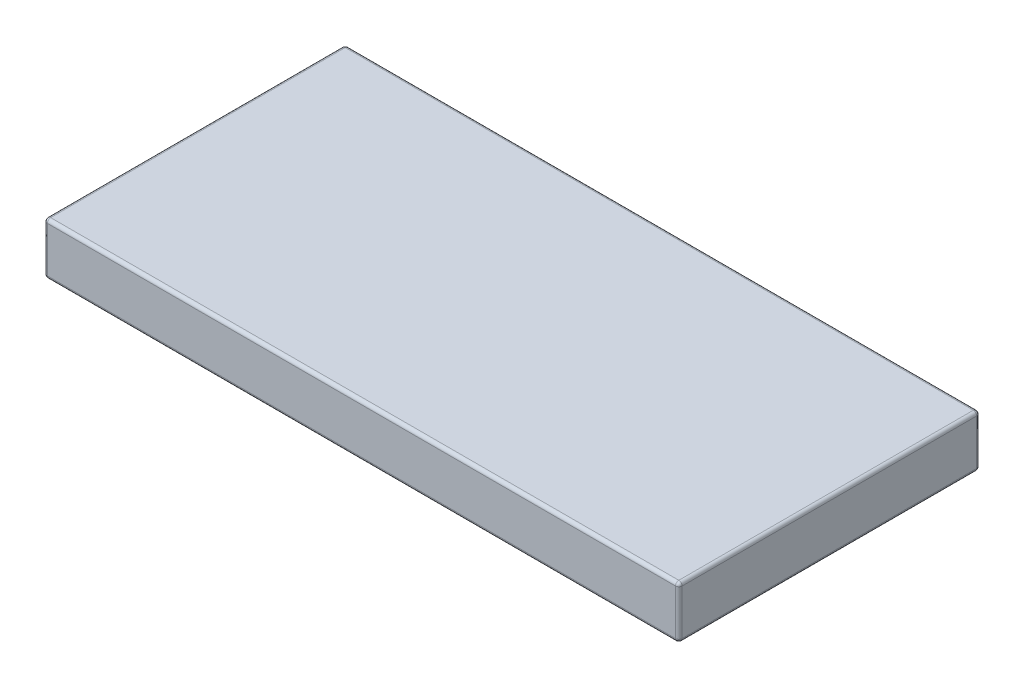
ISO-10303-21;
HEADER;
FILE_DESCRIPTION(('STEP AP214'),'2;1');
FILE_NAME('part.step','',(''),(''),'','','');
FILE_SCHEMA(('AUTOMOTIVE_DESIGN { 1 0 10303 214 1 1 1 1 }'));
ENDSEC;
DATA;
#1=APPLICATION_CONTEXT('core data for automotive mechanical design processes');
#2=APPLICATION_PROTOCOL_DEFINITION('international standard','automotive_design',2000,#1);
#3=PRODUCT_CONTEXT('',#1,'mechanical');
#4=PRODUCT('Part','Part','',(#3));
#5=PRODUCT_RELATED_PRODUCT_CATEGORY('part','',(#4));
#6=PRODUCT_DEFINITION_FORMATION('','',#4);
#7=PRODUCT_DEFINITION_CONTEXT('part definition',#1,'design');
#8=PRODUCT_DEFINITION('design','',#6,#7);
#9=PRODUCT_DEFINITION_SHAPE('','',#8);
#10=(LENGTH_UNIT() NAMED_UNIT(*) SI_UNIT(.MILLI.,.METRE.));
#11=(NAMED_UNIT(*) PLANE_ANGLE_UNIT() SI_UNIT($,.RADIAN.));
#12=(NAMED_UNIT(*) SI_UNIT($,.STERADIAN.) SOLID_ANGLE_UNIT());
#13=UNCERTAINTY_MEASURE_WITH_UNIT(LENGTH_MEASURE(1.E-05),#10,'distance_accuracy_value','');
#14=(GEOMETRIC_REPRESENTATION_CONTEXT(3) GLOBAL_UNCERTAINTY_ASSIGNED_CONTEXT((#13)) GLOBAL_UNIT_ASSIGNED_CONTEXT((#10,
#11,#12)) REPRESENTATION_CONTEXT('',''));
#15=CARTESIAN_POINT('',(0.,0.,0.));
#16=DIRECTION('',(0.,0.,1.));
#17=DIRECTION('',(1.,0.,0.));
#18=AXIS2_PLACEMENT_3D('',#15,#16,#17);
#19=CARTESIAN_POINT('',(9.57,1.57,4.54));
#20=DIRECTION('',(-1.,0.,0.));
#21=DIRECTION('',(0.,0.,1.));
#22=AXIS2_PLACEMENT_3D('',#19,#20,#21);
#23=PLANE('',#22);
#24=DIRECTION('',(0.,0.,-1.));
#25=VECTOR('',#24,1.);
#26=CARTESIAN_POINT('',(9.57,0.1,-4.54));
#27=LINE('',#26,#25);
#28=CARTESIAN_POINT('',(9.57,0.1,4.44));
#29=VERTEX_POINT('',#28);
#30=CARTESIAN_POINT('',(9.57,0.1,-4.44));
#31=VERTEX_POINT('',#30);
#32=EDGE_CURVE('E194',#29,#31,#27,.T.);
#33=ORIENTED_EDGE('',*,*,#32,.T.);
#34=DIRECTION('',(0.,-1.,0.));
#35=VECTOR('',#34,1.);
#36=CARTESIAN_POINT('',(9.57,1.57,-4.44));
#37=LINE('',#36,#35);
#38=CARTESIAN_POINT('',(9.57,1.47,-4.44));
#39=VERTEX_POINT('',#38);
#40=EDGE_CURVE('E197',#31,#39,#37,.F.);
#41=ORIENTED_EDGE('',*,*,#40,.T.);
#42=DIRECTION('',(0.,0.,-1.));
#43=VECTOR('',#42,1.);
#44=CARTESIAN_POINT('',(9.57,1.47,4.54));
#45=LINE('',#44,#43);
#46=CARTESIAN_POINT('',(9.57,1.47,4.44));
#47=VERTEX_POINT('',#46);
#48=EDGE_CURVE('E195',#39,#47,#45,.F.);
#49=ORIENTED_EDGE('',*,*,#48,.T.);
#50=DIRECTION('',(0.,-1.,0.));
#51=VECTOR('',#50,1.);
#52=CARTESIAN_POINT('',(9.57,1.57,4.44));
#53=LINE('',#52,#51);
#54=EDGE_CURVE('E188',#47,#29,#53,.T.);
#55=ORIENTED_EDGE('',*,*,#54,.T.);
#56=EDGE_LOOP('',(#33,#41,#49,#55));
#57=FACE_BOUND('',#56,.T.);
#58=ADVANCED_FACE('F36',(#57),#23,.F.);
#59=CARTESIAN_POINT('',(-9.57,1.57,-4.54));
#60=DIRECTION('',(0.,0.,1.));
#61=DIRECTION('',(1.,0.,0.));
#62=AXIS2_PLACEMENT_3D('',#59,#60,#61);
#63=PLANE('',#62);
#64=DIRECTION('',(-1.,0.,0.));
#65=VECTOR('',#64,1.);
#66=CARTESIAN_POINT('',(-9.57,0.1,-4.54));
#67=LINE('',#66,#65);
#68=CARTESIAN_POINT('',(9.47,0.1,-4.54));
#69=VERTEX_POINT('',#68);
#70=CARTESIAN_POINT('',(-9.47,0.1,-4.54));
#71=VERTEX_POINT('',#70);
#72=EDGE_CURVE('E181',#69,#71,#67,.T.);
#73=ORIENTED_EDGE('',*,*,#72,.T.);
#74=DIRECTION('',(0.,-1.,0.));
#75=VECTOR('',#74,1.);
#76=CARTESIAN_POINT('',(-9.47,1.57,-4.54));
#77=LINE('',#76,#75);
#78=CARTESIAN_POINT('',(-9.47,1.47,-4.54));
#79=VERTEX_POINT('',#78);
#80=EDGE_CURVE('E190',#71,#79,#77,.F.);
#81=ORIENTED_EDGE('',*,*,#80,.T.);
#82=DIRECTION('',(-1.,0.,0.));
#83=VECTOR('',#82,1.);
#84=CARTESIAN_POINT('',(-9.57,1.47,-4.54));
#85=LINE('',#84,#83);
#86=CARTESIAN_POINT('',(9.47,1.47,-4.54));
#87=VERTEX_POINT('',#86);
#88=EDGE_CURVE('E183',#79,#87,#85,.F.);
#89=ORIENTED_EDGE('',*,*,#88,.T.);
#90=DIRECTION('',(0.,-1.,0.));
#91=VECTOR('',#90,1.);
#92=CARTESIAN_POINT('',(9.47,1.57,-4.54));
#93=LINE('',#92,#91);
#94=EDGE_CURVE('E182',#87,#69,#93,.T.);
#95=ORIENTED_EDGE('',*,*,#94,.T.);
#96=EDGE_LOOP('',(#73,#81,#89,#95));
#97=FACE_BOUND('',#96,.T.);
#98=ADVANCED_FACE('F281',(#97),#63,.F.);
#99=CARTESIAN_POINT('',(-9.57,1.57,4.54));
#100=DIRECTION('',(1.,0.,0.));
#101=DIRECTION('',(0.,0.,-1.));
#102=AXIS2_PLACEMENT_3D('',#99,#100,#101);
#103=PLANE('',#102);
#104=DIRECTION('',(0.,0.,1.));
#105=VECTOR('',#104,1.);
#106=CARTESIAN_POINT('',(-9.57,0.1,4.54));
#107=LINE('',#106,#105);
#108=CARTESIAN_POINT('',(-9.57,0.1,-4.44));
#109=VERTEX_POINT('',#108);
#110=CARTESIAN_POINT('',(-9.57,0.1,4.44));
#111=VERTEX_POINT('',#110);
#112=EDGE_CURVE('E171',#109,#111,#107,.T.);
#113=ORIENTED_EDGE('',*,*,#112,.T.);
#114=DIRECTION('',(0.,-1.,0.));
#115=VECTOR('',#114,1.);
#116=CARTESIAN_POINT('',(-9.57,1.57,4.44));
#117=LINE('',#116,#115);
#118=CARTESIAN_POINT('',(-9.57,1.47,4.44));
#119=VERTEX_POINT('',#118);
#120=EDGE_CURVE('E178',#111,#119,#117,.F.);
#121=ORIENTED_EDGE('',*,*,#120,.T.);
#122=DIRECTION('',(0.,0.,1.));
#123=VECTOR('',#122,1.);
#124=CARTESIAN_POINT('',(-9.57,1.47,4.54));
#125=LINE('',#124,#123);
#126=CARTESIAN_POINT('',(-9.57,1.47,-4.44));
#127=VERTEX_POINT('',#126);
#128=EDGE_CURVE('E176',#119,#127,#125,.F.);
#129=ORIENTED_EDGE('',*,*,#128,.T.);
#130=DIRECTION('',(0.,-1.,0.));
#131=VECTOR('',#130,1.);
#132=CARTESIAN_POINT('',(-9.57,1.57,-4.44));
#133=LINE('',#132,#131);
#134=EDGE_CURVE('E174',#127,#109,#133,.T.);
#135=ORIENTED_EDGE('',*,*,#134,.T.);
#136=EDGE_LOOP('',(#113,#121,#129,#135));
#137=FACE_BOUND('',#136,.T.);
#138=ADVANCED_FACE('F274',(#137),#103,.F.);
#139=CARTESIAN_POINT('',(-9.57,1.57,4.54));
#140=DIRECTION('',(0.,0.,-1.));
#141=DIRECTION('',(-1.,0.,0.));
#142=AXIS2_PLACEMENT_3D('',#139,#140,#141);
#143=PLANE('',#142);
#144=DIRECTION('',(1.,0.,0.));
#145=VECTOR('',#144,1.);
#146=CARTESIAN_POINT('',(-9.57,1.47,4.54));
#147=LINE('',#146,#145);
#148=CARTESIAN_POINT('',(9.47,1.47,4.54));
#149=VERTEX_POINT('',#148);
#150=CARTESIAN_POINT('',(-9.47,1.47,4.54));
#151=VERTEX_POINT('',#150);
#152=EDGE_CURVE('E135',#149,#151,#147,.F.);
#153=ORIENTED_EDGE('',*,*,#152,.T.);
#154=DIRECTION('',(0.,-1.,0.));
#155=VECTOR('',#154,1.);
#156=CARTESIAN_POINT('',(-9.47,1.57,4.54));
#157=LINE('',#156,#155);
#158=CARTESIAN_POINT('',(-9.47,0.1,4.54));
#159=VERTEX_POINT('',#158);
#160=EDGE_CURVE('E168',#151,#159,#157,.T.);
#161=ORIENTED_EDGE('',*,*,#160,.T.);
#162=DIRECTION('',(1.,0.,0.));
#163=VECTOR('',#162,1.);
#164=CARTESIAN_POINT('',(9.57,0.1,4.54));
#165=LINE('',#164,#163);
#166=CARTESIAN_POINT('',(9.47,0.1,4.54));
#167=VERTEX_POINT('',#166);
#168=EDGE_CURVE('E162',#159,#167,#165,.T.);
#169=ORIENTED_EDGE('',*,*,#168,.T.);
#170=DIRECTION('',(0.,-1.,0.));
#171=VECTOR('',#170,1.);
#172=CARTESIAN_POINT('',(9.47,1.57,4.54));
#173=LINE('',#172,#171);
#174=EDGE_CURVE('E161',#167,#149,#173,.F.);
#175=ORIENTED_EDGE('',*,*,#174,.T.);
#176=EDGE_LOOP('',(#153,#161,#169,#175));
#177=FACE_BOUND('',#176,.T.);
#178=ADVANCED_FACE('F315',(#177),#143,.F.);
#179=CARTESIAN_POINT('',(0.,1.57,0.));
#180=DIRECTION('',(0.,-1.,0.));
#181=DIRECTION('',(0.,0.,-1.));
#182=AXIS2_PLACEMENT_3D('',#179,#180,#181);
#183=PLANE('',#182);
#184=DIRECTION('',(0.,0.,1.));
#185=VECTOR('',#184,1.);
#186=CARTESIAN_POINT('',(-9.47,1.57,0.));
#187=LINE('',#186,#185);
#188=CARTESIAN_POINT('',(-9.47,1.57,-4.44));
#189=VERTEX_POINT('',#188);
#190=CARTESIAN_POINT('',(-9.47,1.57,4.44));
#191=VERTEX_POINT('',#190);
#192=EDGE_CURVE('E157',#189,#191,#187,.T.);
#193=ORIENTED_EDGE('',*,*,#192,.T.);
#194=DIRECTION('',(1.,0.,0.));
#195=VECTOR('',#194,1.);
#196=CARTESIAN_POINT('',(0.,1.57,4.44));
#197=LINE('',#196,#195);
#198=CARTESIAN_POINT('',(9.47,1.57,4.44));
#199=VERTEX_POINT('',#198);
#200=EDGE_CURVE('E132',#191,#199,#197,.T.);
#201=ORIENTED_EDGE('',*,*,#200,.T.);
#202=DIRECTION('',(0.,0.,-1.));
#203=VECTOR('',#202,1.);
#204=CARTESIAN_POINT('',(9.47,1.57,0.));
#205=LINE('',#204,#203);
#206=CARTESIAN_POINT('',(9.47,1.57,-4.44));
#207=VERTEX_POINT('',#206);
#208=EDGE_CURVE('E149',#199,#207,#205,.T.);
#209=ORIENTED_EDGE('',*,*,#208,.T.);
#210=DIRECTION('',(-1.,0.,0.));
#211=VECTOR('',#210,1.);
#212=CARTESIAN_POINT('',(0.,1.57,-4.44));
#213=LINE('',#212,#211);
#214=EDGE_CURVE('E154',#207,#189,#213,.T.);
#215=ORIENTED_EDGE('',*,*,#214,.T.);
#216=EDGE_LOOP('',(#193,#201,#209,#215));
#217=FACE_BOUND('',#216,.T.);
#218=ADVANCED_FACE('F160',(#217),#183,.F.);
#219=CARTESIAN_POINT('',(0.,0.,0.));
#220=DIRECTION('',(0.,-1.,0.));
#221=DIRECTION('',(0.,0.,-1.));
#222=AXIS2_PLACEMENT_3D('',#219,#220,#221);
#223=PLANE('',#222);
#224=DIRECTION('',(0.,0.,1.));
#225=VECTOR('',#224,1.);
#226=CARTESIAN_POINT('',(-9.47,0.,-4.54));
#227=LINE('',#226,#225);
#228=CARTESIAN_POINT('',(-9.47,0.,4.44));
#229=VERTEX_POINT('',#228);
#230=CARTESIAN_POINT('',(-9.47,0.,-4.44));
#231=VERTEX_POINT('',#230);
#232=EDGE_CURVE('E50',#229,#231,#227,.F.);
#233=ORIENTED_EDGE('',*,*,#232,.T.);
#234=DIRECTION('',(-1.,0.,0.));
#235=VECTOR('',#234,1.);
#236=CARTESIAN_POINT('',(9.57,0.,-4.44));
#237=LINE('',#236,#235);
#238=CARTESIAN_POINT('',(9.47,0.,-4.44));
#239=VERTEX_POINT('',#238);
#240=EDGE_CURVE('E11',#231,#239,#237,.F.);
#241=ORIENTED_EDGE('',*,*,#240,.T.);
#242=DIRECTION('',(0.,0.,-1.));
#243=VECTOR('',#242,1.);
#244=CARTESIAN_POINT('',(9.47,0.,4.54));
#245=LINE('',#244,#243);
#246=CARTESIAN_POINT('',(9.47,0.,4.44));
#247=VERTEX_POINT('',#246);
#248=EDGE_CURVE('E200',#239,#247,#245,.F.);
#249=ORIENTED_EDGE('',*,*,#248,.T.);
#250=DIRECTION('',(1.,0.,0.));
#251=VECTOR('',#250,1.);
#252=CARTESIAN_POINT('',(-9.57,0.,4.44));
#253=LINE('',#252,#251);
#254=EDGE_CURVE('E59',#247,#229,#253,.F.);
#255=ORIENTED_EDGE('',*,*,#254,.T.);
#256=EDGE_LOOP('',(#233,#241,#249,#255));
#257=FACE_BOUND('',#256,.T.);
#258=ADVANCED_FACE('F297',(#257),#223,.T.);
#259=CARTESIAN_POINT('',(-9.57,0.1,-4.44));
#260=DIRECTION('',(1.,0.,0.));
#261=DIRECTION('',(0.,0.,-1.));
#262=AXIS2_PLACEMENT_3D('',#259,#260,#261);
#263=CYLINDRICAL_SURFACE('',#262,0.1);
#264=CARTESIAN_POINT('',(-9.47,0.1,-4.44));
#265=DIRECTION('',(-1.,0.,0.));
#266=DIRECTION('',(0.,0.,1.));
#267=AXIS2_PLACEMENT_3D('',#264,#265,#266);
#268=CIRCLE('',#267,0.1);
#269=EDGE_CURVE('E45',#71,#231,#268,.T.);
#270=ORIENTED_EDGE('',*,*,#269,.F.);
#271=ORIENTED_EDGE('',*,*,#72,.F.);
#272=CARTESIAN_POINT('',(9.47,0.1,-4.44));
#273=DIRECTION('',(1.,0.,0.));
#274=DIRECTION('',(0.,0.,-1.));
#275=AXIS2_PLACEMENT_3D('',#272,#273,#274);
#276=CIRCLE('',#275,0.1);
#277=EDGE_CURVE('E251',#239,#69,#276,.T.);
#278=ORIENTED_EDGE('',*,*,#277,.F.);
#279=ORIENTED_EDGE('',*,*,#240,.F.);
#280=EDGE_LOOP('',(#270,#271,#278,#279));
#281=FACE_BOUND('',#280,.T.);
#282=ADVANCED_FACE('F37',(#281),#263,.T.);
#283=CARTESIAN_POINT('',(-9.47,0.1,-4.44));
#284=DIRECTION('',(0.,-1.,0.));
#285=DIRECTION('',(0.,0.,-1.));
#286=AXIS2_PLACEMENT_3D('',#283,#284,#285);
#287=SPHERICAL_SURFACE('',#286,0.1);
#288=CARTESIAN_POINT('',(-9.47,0.1,-4.44));
#289=DIRECTION('',(0.,-1.,0.));
#290=DIRECTION('',(0.,0.,-1.));
#291=AXIS2_PLACEMENT_3D('',#288,#289,#290);
#292=CIRCLE('',#291,0.1);
#293=EDGE_CURVE('E247',#71,#109,#292,.F.);
#294=ORIENTED_EDGE('',*,*,#293,.F.);
#295=ORIENTED_EDGE('',*,*,#269,.T.);
#296=CARTESIAN_POINT('',(-9.47,0.1,-4.44));
#297=DIRECTION('',(0.,0.,-1.));
#298=DIRECTION('',(-1.,0.,0.));
#299=AXIS2_PLACEMENT_3D('',#296,#297,#298);
#300=CIRCLE('',#299,0.1);
#301=EDGE_CURVE('E253',#109,#231,#300,.F.);
#302=ORIENTED_EDGE('',*,*,#301,.F.);
#303=EDGE_LOOP('',(#294,#295,#302));
#304=FACE_BOUND('',#303,.T.);
#305=ADVANCED_FACE('F262',(#304),#287,.T.);
#306=CARTESIAN_POINT('',(9.47,0.1,-4.44));
#307=DIRECTION('',(0.,0.,-1.));
#308=DIRECTION('',(0.,1.,0.));
#309=AXIS2_PLACEMENT_3D('',#306,#307,#308);
#310=SPHERICAL_SURFACE('',#309,0.1);
#311=CARTESIAN_POINT('',(9.47,0.1,-4.44));
#312=DIRECTION('',(0.,0.,-1.));
#313=DIRECTION('',(-1.,0.,0.));
#314=AXIS2_PLACEMENT_3D('',#311,#312,#313);
#315=CIRCLE('',#314,0.1);
#316=EDGE_CURVE('E244',#239,#31,#315,.F.);
#317=ORIENTED_EDGE('',*,*,#316,.F.);
#318=ORIENTED_EDGE('',*,*,#277,.T.);
#319=CARTESIAN_POINT('',(9.47,0.1,-4.44));
#320=DIRECTION('',(0.,-1.,0.));
#321=DIRECTION('',(0.,0.,-1.));
#322=AXIS2_PLACEMENT_3D('',#319,#320,#321);
#323=CIRCLE('',#322,0.1);
#324=EDGE_CURVE('E243',#31,#69,#323,.F.);
#325=ORIENTED_EDGE('',*,*,#324,.F.);
#326=EDGE_LOOP('',(#317,#318,#325));
#327=FACE_BOUND('',#326,.T.);
#328=ADVANCED_FACE('F464',(#327),#310,.T.);
#329=CARTESIAN_POINT('',(-9.47,0.1,4.54));
#330=DIRECTION('',(0.,0.,-1.));
#331=DIRECTION('',(-1.,0.,0.));
#332=AXIS2_PLACEMENT_3D('',#329,#330,#331);
#333=CYLINDRICAL_SURFACE('',#332,0.1);
#334=ORIENTED_EDGE('',*,*,#301,.T.);
#335=ORIENTED_EDGE('',*,*,#232,.F.);
#336=CARTESIAN_POINT('',(-9.47,0.1,4.44));
#337=DIRECTION('',(0.,0.,1.));
#338=DIRECTION('',(1.,0.,0.));
#339=AXIS2_PLACEMENT_3D('',#336,#337,#338);
#340=CIRCLE('',#339,0.1);
#341=EDGE_CURVE('E237',#111,#229,#340,.T.);
#342=ORIENTED_EDGE('',*,*,#341,.F.);
#343=ORIENTED_EDGE('',*,*,#112,.F.);
#344=EDGE_LOOP('',(#334,#335,#342,#343));
#345=FACE_BOUND('',#344,.T.);
#346=ADVANCED_FACE('F269',(#345),#333,.T.);
#347=CARTESIAN_POINT('',(-9.47,1.57,-4.44));
#348=DIRECTION('',(0.,-1.,0.));
#349=DIRECTION('',(0.,0.,-1.));
#350=AXIS2_PLACEMENT_3D('',#347,#348,#349);
#351=CYLINDRICAL_SURFACE('',#350,0.1);
#352=ORIENTED_EDGE('',*,*,#293,.T.);
#353=ORIENTED_EDGE('',*,*,#134,.F.);
#354=CARTESIAN_POINT('',(-9.47,1.47,-4.44));
#355=DIRECTION('',(0.,1.,0.));
#356=DIRECTION('',(0.,0.,1.));
#357=AXIS2_PLACEMENT_3D('',#354,#355,#356);
#358=CIRCLE('',#357,0.1);
#359=EDGE_CURVE('E234',#79,#127,#358,.T.);
#360=ORIENTED_EDGE('',*,*,#359,.F.);
#361=ORIENTED_EDGE('',*,*,#80,.F.);
#362=EDGE_LOOP('',(#352,#353,#360,#361));
#363=FACE_BOUND('',#362,.T.);
#364=ADVANCED_FACE('F282',(#363),#351,.T.);
#365=CARTESIAN_POINT('',(0.,1.47,-4.44));
#366=DIRECTION('',(-1.,0.,0.));
#367=DIRECTION('',(0.,0.,1.));
#368=AXIS2_PLACEMENT_3D('',#365,#366,#367);
#369=CYLINDRICAL_SURFACE('',#368,0.1);
#370=CARTESIAN_POINT('',(9.47,1.47,-4.44));
#371=DIRECTION('',(1.,0.,0.));
#372=DIRECTION('',(0.,0.,-1.));
#373=AXIS2_PLACEMENT_3D('',#370,#371,#372);
#374=CIRCLE('',#373,0.1);
#375=EDGE_CURVE('E229',#87,#207,#374,.T.);
#376=ORIENTED_EDGE('',*,*,#375,.F.);
#377=ORIENTED_EDGE('',*,*,#88,.F.);
#378=CARTESIAN_POINT('',(-9.47,1.47,-4.44));
#379=DIRECTION('',(-1.,0.,0.));
#380=DIRECTION('',(0.,0.,1.));
#381=AXIS2_PLACEMENT_3D('',#378,#379,#380);
#382=CIRCLE('',#381,0.1);
#383=EDGE_CURVE('E228',#189,#79,#382,.T.);
#384=ORIENTED_EDGE('',*,*,#383,.F.);
#385=ORIENTED_EDGE('',*,*,#214,.F.);
#386=EDGE_LOOP('',(#376,#377,#384,#385));
#387=FACE_BOUND('',#386,.T.);
#388=ADVANCED_FACE('F289',(#387),#369,.T.);
#389=CARTESIAN_POINT('',(9.47,1.57,-4.44));
#390=DIRECTION('',(0.,-1.,0.));
#391=DIRECTION('',(0.,0.,-1.));
#392=AXIS2_PLACEMENT_3D('',#389,#390,#391);
#393=CYLINDRICAL_SURFACE('',#392,0.1);
#394=ORIENTED_EDGE('',*,*,#324,.T.);
#395=ORIENTED_EDGE('',*,*,#94,.F.);
#396=CARTESIAN_POINT('',(9.47,1.47,-4.44));
#397=DIRECTION('',(0.,1.,0.));
#398=DIRECTION('',(0.,0.,1.));
#399=AXIS2_PLACEMENT_3D('',#396,#397,#398);
#400=CIRCLE('',#399,0.1);
#401=EDGE_CURVE('E223',#39,#87,#400,.T.);
#402=ORIENTED_EDGE('',*,*,#401,.F.);
#403=ORIENTED_EDGE('',*,*,#40,.F.);
#404=EDGE_LOOP('',(#394,#395,#402,#403));
#405=FACE_BOUND('',#404,.T.);
#406=ADVANCED_FACE('F294',(#405),#393,.T.);
#407=CARTESIAN_POINT('',(9.47,0.1,4.54));
#408=DIRECTION('',(0.,0.,1.));
#409=DIRECTION('',(1.,0.,0.));
#410=AXIS2_PLACEMENT_3D('',#407,#408,#409);
#411=CYLINDRICAL_SURFACE('',#410,0.1);
#412=ORIENTED_EDGE('',*,*,#316,.T.);
#413=ORIENTED_EDGE('',*,*,#32,.F.);
#414=CARTESIAN_POINT('',(9.47,0.1,4.44));
#415=DIRECTION('',(0.,0.,1.));
#416=DIRECTION('',(1.,0.,0.));
#417=AXIS2_PLACEMENT_3D('',#414,#415,#416);
#418=CIRCLE('',#417,0.1);
#419=EDGE_CURVE('E225',#247,#29,#418,.T.);
#420=ORIENTED_EDGE('',*,*,#419,.F.);
#421=ORIENTED_EDGE('',*,*,#248,.F.);
#422=EDGE_LOOP('',(#412,#413,#420,#421));
#423=FACE_BOUND('',#422,.T.);
#424=ADVANCED_FACE('F301',(#423),#411,.T.);
#425=CARTESIAN_POINT('',(-9.57,0.1,4.44));
#426=DIRECTION('',(-1.,0.,0.));
#427=DIRECTION('',(0.,0.,1.));
#428=AXIS2_PLACEMENT_3D('',#425,#426,#427);
#429=CYLINDRICAL_SURFACE('',#428,0.1);
#430=CARTESIAN_POINT('',(-9.47,0.1,4.44));
#431=DIRECTION('',(-1.,0.,0.));
#432=DIRECTION('',(0.,0.,1.));
#433=AXIS2_PLACEMENT_3D('',#430,#431,#432);
#434=CIRCLE('',#433,0.1);
#435=EDGE_CURVE('E239',#229,#159,#434,.T.);
#436=ORIENTED_EDGE('',*,*,#435,.F.);
#437=ORIENTED_EDGE('',*,*,#254,.F.);
#438=CARTESIAN_POINT('',(9.47,0.1,4.44));
#439=DIRECTION('',(1.,0.,0.));
#440=DIRECTION('',(0.,0.,-1.));
#441=AXIS2_PLACEMENT_3D('',#438,#439,#440);
#442=CIRCLE('',#441,0.1);
#443=EDGE_CURVE('E218',#167,#247,#442,.T.);
#444=ORIENTED_EDGE('',*,*,#443,.F.);
#445=ORIENTED_EDGE('',*,*,#168,.F.);
#446=EDGE_LOOP('',(#436,#437,#444,#445));
#447=FACE_BOUND('',#446,.T.);
#448=ADVANCED_FACE('F303',(#447),#429,.T.);
#449=CARTESIAN_POINT('',(-9.47,0.1,4.44));
#450=DIRECTION('',(0.,-1.,0.));
#451=DIRECTION('',(0.,0.,-1.));
#452=AXIS2_PLACEMENT_3D('',#449,#450,#451);
#453=SPHERICAL_SURFACE('',#452,0.1);
#454=ORIENTED_EDGE('',*,*,#341,.T.);
#455=ORIENTED_EDGE('',*,*,#435,.T.);
#456=CARTESIAN_POINT('',(-9.47,0.1,4.44));
#457=DIRECTION('',(0.,-1.,0.));
#458=DIRECTION('',(0.,0.,-1.));
#459=AXIS2_PLACEMENT_3D('',#456,#457,#458);
#460=CIRCLE('',#459,0.1);
#461=EDGE_CURVE('E216',#111,#159,#460,.F.);
#462=ORIENTED_EDGE('',*,*,#461,.F.);
#463=EDGE_LOOP('',(#454,#455,#462));
#464=FACE_BOUND('',#463,.T.);
#465=ADVANCED_FACE('F312',(#464),#453,.T.);
#466=CARTESIAN_POINT('',(-9.47,1.47,-4.44));
#467=DIRECTION('',(0.,0.,-1.));
#468=DIRECTION('',(-1.,0.,0.));
#469=AXIS2_PLACEMENT_3D('',#466,#467,#468);
#470=SPHERICAL_SURFACE('',#469,0.1);
#471=ORIENTED_EDGE('',*,*,#383,.T.);
#472=ORIENTED_EDGE('',*,*,#359,.T.);
#473=CARTESIAN_POINT('',(-9.47,1.47,-4.44));
#474=DIRECTION('',(0.,0.,-1.));
#475=DIRECTION('',(0.,1.,0.));
#476=AXIS2_PLACEMENT_3D('',#473,#474,#475);
#477=CIRCLE('',#476,0.1);
#478=EDGE_CURVE('E212',#189,#127,#477,.F.);
#479=ORIENTED_EDGE('',*,*,#478,.F.);
#480=EDGE_LOOP('',(#471,#472,#479));
#481=FACE_BOUND('',#480,.T.);
#482=ADVANCED_FACE('F324',(#481),#470,.T.);
#483=CARTESIAN_POINT('',(9.47,1.47,-4.44));
#484=DIRECTION('',(0.,0.,-1.));
#485=DIRECTION('',(-1.,0.,0.));
#486=AXIS2_PLACEMENT_3D('',#483,#484,#485);
#487=SPHERICAL_SURFACE('',#486,0.1);
#488=ORIENTED_EDGE('',*,*,#401,.T.);
#489=ORIENTED_EDGE('',*,*,#375,.T.);
#490=CARTESIAN_POINT('',(9.47,1.47,-4.44));
#491=DIRECTION('',(0.,0.,-1.));
#492=DIRECTION('',(-1.,0.,0.));
#493=AXIS2_PLACEMENT_3D('',#490,#491,#492);
#494=CIRCLE('',#493,0.1);
#495=EDGE_CURVE('E155',#39,#207,#494,.F.);
#496=ORIENTED_EDGE('',*,*,#495,.F.);
#497=EDGE_LOOP('',(#488,#489,#496));
#498=FACE_BOUND('',#497,.T.);
#499=ADVANCED_FACE('F330',(#498),#487,.T.);
#500=CARTESIAN_POINT('',(9.47,0.1,4.44));
#501=DIRECTION('',(0.,-1.,0.));
#502=DIRECTION('',(0.,0.,-1.));
#503=AXIS2_PLACEMENT_3D('',#500,#501,#502);
#504=SPHERICAL_SURFACE('',#503,0.1);
#505=ORIENTED_EDGE('',*,*,#443,.T.);
#506=ORIENTED_EDGE('',*,*,#419,.T.);
#507=CARTESIAN_POINT('',(9.47,0.1,4.44));
#508=DIRECTION('',(0.,-1.,0.));
#509=DIRECTION('',(0.,0.,-1.));
#510=AXIS2_PLACEMENT_3D('',#507,#508,#509);
#511=CIRCLE('',#510,0.1);
#512=EDGE_CURVE('E209',#167,#29,#511,.F.);
#513=ORIENTED_EDGE('',*,*,#512,.F.);
#514=EDGE_LOOP('',(#505,#506,#513));
#515=FACE_BOUND('',#514,.T.);
#516=ADVANCED_FACE('F307',(#515),#504,.T.);
#517=CARTESIAN_POINT('',(-9.47,1.57,4.44));
#518=DIRECTION('',(0.,-1.,0.));
#519=DIRECTION('',(0.,0.,-1.));
#520=AXIS2_PLACEMENT_3D('',#517,#518,#519);
#521=CYLINDRICAL_SURFACE('',#520,0.1);
#522=ORIENTED_EDGE('',*,*,#461,.T.);
#523=ORIENTED_EDGE('',*,*,#160,.F.);
#524=CARTESIAN_POINT('',(-9.47,1.47,4.44));
#525=DIRECTION('',(0.,1.,0.));
#526=DIRECTION('',(0.,0.,1.));
#527=AXIS2_PLACEMENT_3D('',#524,#525,#526);
#528=CIRCLE('',#527,0.1);
#529=EDGE_CURVE('E210',#119,#151,#528,.T.);
#530=ORIENTED_EDGE('',*,*,#529,.F.);
#531=ORIENTED_EDGE('',*,*,#120,.F.);
#532=EDGE_LOOP('',(#522,#523,#530,#531));
#533=FACE_BOUND('',#532,.T.);
#534=ADVANCED_FACE('F320',(#533),#521,.T.);
#535=CARTESIAN_POINT('',(-9.47,1.47,0.));
#536=DIRECTION('',(0.,0.,1.));
#537=DIRECTION('',(1.,0.,0.));
#538=AXIS2_PLACEMENT_3D('',#535,#536,#537);
#539=CYLINDRICAL_SURFACE('',#538,0.1);
#540=ORIENTED_EDGE('',*,*,#478,.T.);
#541=ORIENTED_EDGE('',*,*,#128,.F.);
#542=CARTESIAN_POINT('',(-9.47,1.47,4.44));
#543=DIRECTION('',(0.,0.,1.));
#544=DIRECTION('',(1.,0.,0.));
#545=AXIS2_PLACEMENT_3D('',#542,#543,#544);
#546=CIRCLE('',#545,0.1);
#547=EDGE_CURVE('E148',#191,#119,#546,.T.);
#548=ORIENTED_EDGE('',*,*,#547,.F.);
#549=ORIENTED_EDGE('',*,*,#192,.F.);
#550=EDGE_LOOP('',(#540,#541,#548,#549));
#551=FACE_BOUND('',#550,.T.);
#552=ADVANCED_FACE('F323',(#551),#539,.T.);
#553=CARTESIAN_POINT('',(9.47,1.47,0.));
#554=DIRECTION('',(0.,0.,-1.));
#555=DIRECTION('',(-1.,0.,0.));
#556=AXIS2_PLACEMENT_3D('',#553,#554,#555);
#557=CYLINDRICAL_SURFACE('',#556,0.1);
#558=ORIENTED_EDGE('',*,*,#495,.T.);
#559=ORIENTED_EDGE('',*,*,#208,.F.);
#560=CARTESIAN_POINT('',(9.47,1.47,4.44));
#561=DIRECTION('',(0.,0.,1.));
#562=DIRECTION('',(1.,0.,0.));
#563=AXIS2_PLACEMENT_3D('',#560,#561,#562);
#564=CIRCLE('',#563,0.1);
#565=EDGE_CURVE('E137',#47,#199,#564,.T.);
#566=ORIENTED_EDGE('',*,*,#565,.F.);
#567=ORIENTED_EDGE('',*,*,#48,.F.);
#568=EDGE_LOOP('',(#558,#559,#566,#567));
#569=FACE_BOUND('',#568,.T.);
#570=ADVANCED_FACE('F147',(#569),#557,.T.);
#571=CARTESIAN_POINT('',(9.47,1.57,4.44));
#572=DIRECTION('',(0.,-1.,0.));
#573=DIRECTION('',(0.,0.,-1.));
#574=AXIS2_PLACEMENT_3D('',#571,#572,#573);
#575=CYLINDRICAL_SURFACE('',#574,0.1);
#576=ORIENTED_EDGE('',*,*,#512,.T.);
#577=ORIENTED_EDGE('',*,*,#54,.F.);
#578=CARTESIAN_POINT('',(9.47,1.47,4.44));
#579=DIRECTION('',(0.,1.,0.));
#580=DIRECTION('',(0.,0.,1.));
#581=AXIS2_PLACEMENT_3D('',#578,#579,#580);
#582=CIRCLE('',#581,0.1);
#583=EDGE_CURVE('E142',#149,#47,#582,.T.);
#584=ORIENTED_EDGE('',*,*,#583,.F.);
#585=ORIENTED_EDGE('',*,*,#174,.F.);
#586=EDGE_LOOP('',(#576,#577,#584,#585));
#587=FACE_BOUND('',#586,.T.);
#588=ADVANCED_FACE('F309',(#587),#575,.T.);
#589=CARTESIAN_POINT('',(-9.47,1.47,4.44));
#590=DIRECTION('',(-1.,0.,0.));
#591=DIRECTION('',(0.,0.,1.));
#592=AXIS2_PLACEMENT_3D('',#589,#590,#591);
#593=SPHERICAL_SURFACE('',#592,0.1);
#594=ORIENTED_EDGE('',*,*,#547,.T.);
#595=ORIENTED_EDGE('',*,*,#529,.T.);
#596=CARTESIAN_POINT('',(-9.47,1.47,4.44));
#597=DIRECTION('',(-1.,0.,0.));
#598=DIRECTION('',(0.,0.,1.));
#599=AXIS2_PLACEMENT_3D('',#596,#597,#598);
#600=CIRCLE('',#599,0.1);
#601=EDGE_CURVE('E133',#191,#151,#600,.F.);
#602=ORIENTED_EDGE('',*,*,#601,.F.);
#603=EDGE_LOOP('',(#594,#595,#602));
#604=FACE_BOUND('',#603,.T.);
#605=ADVANCED_FACE('F321',(#604),#593,.T.);
#606=CARTESIAN_POINT('',(9.47,1.47,4.44));
#607=DIRECTION('',(1.,0.,0.));
#608=DIRECTION('',(0.,0.,-1.));
#609=AXIS2_PLACEMENT_3D('',#606,#607,#608);
#610=SPHERICAL_SURFACE('',#609,0.1);
#611=ORIENTED_EDGE('',*,*,#583,.T.);
#612=ORIENTED_EDGE('',*,*,#565,.T.);
#613=CARTESIAN_POINT('',(9.47,1.47,4.44));
#614=DIRECTION('',(1.,0.,0.));
#615=DIRECTION('',(0.,0.,-1.));
#616=AXIS2_PLACEMENT_3D('',#613,#614,#615);
#617=CIRCLE('',#616,0.1);
#618=EDGE_CURVE('E130',#149,#199,#617,.F.);
#619=ORIENTED_EDGE('',*,*,#618,.F.);
#620=EDGE_LOOP('',(#611,#612,#619));
#621=FACE_BOUND('',#620,.T.);
#622=ADVANCED_FACE('F136',(#621),#610,.T.);
#623=CARTESIAN_POINT('',(0.,1.47,4.44));
#624=DIRECTION('',(1.,0.,0.));
#625=DIRECTION('',(0.,0.,-1.));
#626=AXIS2_PLACEMENT_3D('',#623,#624,#625);
#627=CYLINDRICAL_SURFACE('',#626,0.1);
#628=ORIENTED_EDGE('',*,*,#601,.T.);
#629=ORIENTED_EDGE('',*,*,#152,.F.);
#630=ORIENTED_EDGE('',*,*,#618,.T.);
#631=ORIENTED_EDGE('',*,*,#200,.F.);
#632=EDGE_LOOP('',(#628,#629,#630,#631));
#633=FACE_BOUND('',#632,.T.);
#634=ADVANCED_FACE('F129',(#633),#627,.T.);
#635=CLOSED_SHELL('',(#58,#98,#138,#178,#218,#258,#282,#305,#328,#346,#364,#388,#406,#424,#448,
#465,#482,#499,#516,#534,#552,#570,#588,#605,#622,#634));
#636=MANIFOLD_SOLID_BREP('B2',#635);
#637=ADVANCED_BREP_SHAPE_REPRESENTATION('',(#18,#636),#14);
#638=SHAPE_DEFINITION_REPRESENTATION(#9,#637);
ENDSEC;
END-ISO-10303-21;
